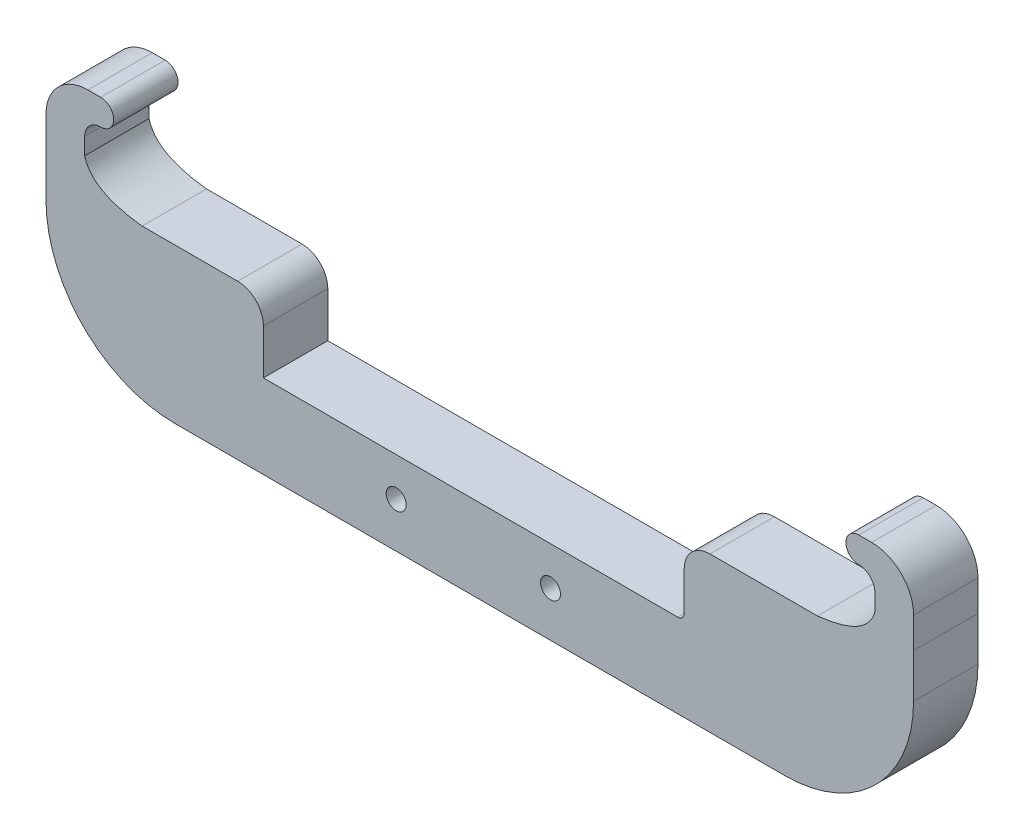
ISO-10303-21;
HEADER;
FILE_DESCRIPTION(('STEP AP214'),'2;1');
FILE_NAME('part.step','',(''),(''),'','','');
FILE_SCHEMA(('AUTOMOTIVE_DESIGN { 1 0 10303 214 1 1 1 1 }'));
ENDSEC;
DATA;
#1=APPLICATION_CONTEXT('core data for automotive mechanical design processes');
#2=APPLICATION_PROTOCOL_DEFINITION('international standard','automotive_design',2000,#1);
#3=PRODUCT_CONTEXT('',#1,'mechanical');
#4=PRODUCT('Part','Part','',(#3));
#5=PRODUCT_RELATED_PRODUCT_CATEGORY('part','',(#4));
#6=PRODUCT_DEFINITION_FORMATION('','',#4);
#7=PRODUCT_DEFINITION_CONTEXT('part definition',#1,'design');
#8=PRODUCT_DEFINITION('design','',#6,#7);
#9=PRODUCT_DEFINITION_SHAPE('','',#8);
#10=(LENGTH_UNIT() NAMED_UNIT(*) SI_UNIT(.MILLI.,.METRE.));
#11=(NAMED_UNIT(*) PLANE_ANGLE_UNIT() SI_UNIT($,.RADIAN.));
#12=(NAMED_UNIT(*) SI_UNIT($,.STERADIAN.) SOLID_ANGLE_UNIT());
#13=UNCERTAINTY_MEASURE_WITH_UNIT(LENGTH_MEASURE(1.E-05),#10,'distance_accuracy_value','');
#14=(GEOMETRIC_REPRESENTATION_CONTEXT(3) GLOBAL_UNCERTAINTY_ASSIGNED_CONTEXT((#13)) GLOBAL_UNIT_ASSIGNED_CONTEXT((#10,
#11,#12)) REPRESENTATION_CONTEXT('',''));
#15=CARTESIAN_POINT('',(0.,0.,0.));
#16=DIRECTION('',(0.,0.,1.));
#17=DIRECTION('',(1.,0.,0.));
#18=AXIS2_PLACEMENT_3D('',#15,#16,#17);
#19=CARTESIAN_POINT('',(559.303105377601,-407.696233575766,10.));
#20=DIRECTION('',(0.,0.,-1.));
#21=DIRECTION('',(-1.,0.,0.));
#22=AXIS2_PLACEMENT_3D('',#19,#20,#21);
#23=CYLINDRICAL_SURFACE('',#22,6.50000000000006);
#24=CARTESIAN_POINT('',(559.303105377601,-407.696233575766,0.));
#25=DIRECTION('',(0.,0.,1.));
#26=DIRECTION('',(1.,0.,0.));
#27=AXIS2_PLACEMENT_3D('',#24,#25,#26);
#28=CIRCLE('',#27,6.50000000000006);
#29=CARTESIAN_POINT('',(559.303105377601,-401.196233575766,0.));
#30=VERTEX_POINT('',#29);
#31=CARTESIAN_POINT('',(552.803105377601,-407.696233575766,0.));
#32=VERTEX_POINT('',#31);
#33=EDGE_CURVE('E237',#30,#32,#28,.T.);
#34=ORIENTED_EDGE('',*,*,#33,.T.);
#35=DIRECTION('',(0.,0.,-1.));
#36=VECTOR('',#35,1.);
#37=CARTESIAN_POINT('',(552.803105377601,-407.696233575766,10.));
#38=LINE('',#37,#36);
#39=CARTESIAN_POINT('',(552.803105377601,-407.696233575766,10.));
#40=VERTEX_POINT('',#39);
#41=EDGE_CURVE('E11',#40,#32,#38,.T.);
#42=ORIENTED_EDGE('',*,*,#41,.F.);
#43=CARTESIAN_POINT('',(559.303105377601,-407.696233575766,10.));
#44=DIRECTION('',(0.,0.,1.));
#45=DIRECTION('',(1.,0.,0.));
#46=AXIS2_PLACEMENT_3D('',#43,#44,#45);
#47=CIRCLE('',#46,6.50000000000006);
#48=CARTESIAN_POINT('',(559.303105377601,-401.196233575766,10.));
#49=VERTEX_POINT('',#48);
#50=EDGE_CURVE('E317',#49,#40,#47,.T.);
#51=ORIENTED_EDGE('',*,*,#50,.F.);
#52=DIRECTION('',(0.,0.,-1.));
#53=VECTOR('',#52,1.);
#54=CARTESIAN_POINT('',(559.303105377601,-401.196233575766,10.));
#55=LINE('',#54,#53);
#56=EDGE_CURVE('E233',#49,#30,#55,.T.);
#57=ORIENTED_EDGE('',*,*,#56,.T.);
#58=EDGE_LOOP('',(#34,#42,#51,#57));
#59=FACE_BOUND('',#58,.T.);
#60=ADVANCED_FACE('F34',(#59),#23,.T.);
#61=CARTESIAN_POINT('',(552.803105377601,-412.499258381393,10.));
#62=DIRECTION('',(1.,0.,0.));
#63=DIRECTION('',(0.,0.,-1.));
#64=AXIS2_PLACEMENT_3D('',#61,#62,#63);
#65=PLANE('',#64);
#66=DIRECTION('',(0.,-1.,0.));
#67=VECTOR('',#66,1.);
#68=CARTESIAN_POINT('',(552.803105377601,-412.499258381393,0.));
#69=LINE('',#68,#67);
#70=CARTESIAN_POINT('',(552.803105377601,-419.296174139032,0.));
#71=VERTEX_POINT('',#70);
#72=EDGE_CURVE('E240',#32,#71,#69,.T.);
#73=ORIENTED_EDGE('',*,*,#72,.T.);
#74=DIRECTION('',(0.,0.,-1.));
#75=VECTOR('',#74,1.);
#76=CARTESIAN_POINT('',(552.803105377601,-419.296174139032,10.));
#77=LINE('',#76,#75);
#78=CARTESIAN_POINT('',(552.803105377601,-419.296174139032,10.));
#79=VERTEX_POINT('',#78);
#80=EDGE_CURVE('E42',#79,#71,#77,.T.);
#81=ORIENTED_EDGE('',*,*,#80,.F.);
#82=DIRECTION('',(0.,-1.,0.));
#83=VECTOR('',#82,1.);
#84=CARTESIAN_POINT('',(552.803105377601,-407.696233575766,10.));
#85=LINE('',#84,#83);
#86=EDGE_CURVE('E147',#40,#79,#85,.T.);
#87=ORIENTED_EDGE('',*,*,#86,.F.);
#88=ORIENTED_EDGE('',*,*,#41,.T.);
#89=EDGE_LOOP('',(#73,#81,#87,#88));
#90=FACE_BOUND('',#89,.T.);
#91=ADVANCED_FACE('F461',(#90),#65,.F.);
#92=CARTESIAN_POINT('',(572.803105377601,-419.296174139032,10.));
#93=DIRECTION('',(0.,0.,-1.));
#94=DIRECTION('',(-1.,0.,0.));
#95=AXIS2_PLACEMENT_3D('',#92,#93,#94);
#96=CYLINDRICAL_SURFACE('',#95,20.);
#97=CARTESIAN_POINT('',(572.803105377601,-419.296174139032,0.));
#98=DIRECTION('',(0.,0.,1.));
#99=DIRECTION('',(1.,0.,0.));
#100=AXIS2_PLACEMENT_3D('',#97,#98,#99);
#101=CIRCLE('',#100,20.);
#102=CARTESIAN_POINT('',(572.803105377601,-439.296174139032,0.));
#103=VERTEX_POINT('',#102);
#104=EDGE_CURVE('E243',#71,#103,#101,.T.);
#105=ORIENTED_EDGE('',*,*,#104,.T.);
#106=DIRECTION('',(0.,0.,-1.));
#107=VECTOR('',#106,1.);
#108=CARTESIAN_POINT('',(572.803105377601,-439.296174139032,10.));
#109=LINE('',#108,#107);
#110=CARTESIAN_POINT('',(572.803105377601,-439.296174139032,10.));
#111=VERTEX_POINT('',#110);
#112=EDGE_CURVE('E361',#111,#103,#109,.T.);
#113=ORIENTED_EDGE('',*,*,#112,.F.);
#114=CARTESIAN_POINT('',(572.803105377601,-419.296174139032,10.));
#115=DIRECTION('',(0.,0.,1.));
#116=DIRECTION('',(1.,0.,0.));
#117=AXIS2_PLACEMENT_3D('',#114,#115,#116);
#118=CIRCLE('',#117,20.);
#119=EDGE_CURVE('E369',#79,#111,#118,.T.);
#120=ORIENTED_EDGE('',*,*,#119,.F.);
#121=ORIENTED_EDGE('',*,*,#80,.T.);
#122=EDGE_LOOP('',(#105,#113,#120,#121));
#123=FACE_BOUND('',#122,.T.);
#124=ADVANCED_FACE('F367',(#123),#96,.T.);
#125=CARTESIAN_POINT('',(650.135201584219,-439.296174139032,10.));
#126=DIRECTION('',(0.,1.,0.));
#127=DIRECTION('',(0.,0.,1.));
#128=AXIS2_PLACEMENT_3D('',#125,#126,#127);
#129=PLANE('',#128);
#130=DIRECTION('',(1.,0.,0.));
#131=VECTOR('',#130,1.);
#132=CARTESIAN_POINT('',(650.135201584219,-439.296174139032,0.));
#133=LINE('',#132,#131);
#134=CARTESIAN_POINT('',(667.497764868729,-439.296174139032,0.));
#135=VERTEX_POINT('',#134);
#136=EDGE_CURVE('E246',#103,#135,#133,.T.);
#137=ORIENTED_EDGE('',*,*,#136,.T.);
#138=DIRECTION('',(0.,0.,-1.));
#139=VECTOR('',#138,1.);
#140=CARTESIAN_POINT('',(667.497764868729,-439.296174139032,10.));
#141=LINE('',#140,#139);
#142=CARTESIAN_POINT('',(667.497764868729,-439.296174139032,10.));
#143=VERTEX_POINT('',#142);
#144=EDGE_CURVE('E359',#143,#135,#141,.T.);
#145=ORIENTED_EDGE('',*,*,#144,.F.);
#146=DIRECTION('',(-1.,0.,0.));
#147=VECTOR('',#146,1.);
#148=CARTESIAN_POINT('',(588.3050680705,-439.296174139032,10.));
#149=LINE('',#148,#147);
#150=EDGE_CURVE('E379',#143,#111,#149,.T.);
#151=ORIENTED_EDGE('',*,*,#150,.T.);
#152=ORIENTED_EDGE('',*,*,#112,.T.);
#153=EDGE_LOOP('',(#137,#145,#151,#152));
#154=FACE_BOUND('',#153,.T.);
#155=ADVANCED_FACE('F378',(#154),#129,.F.);
#156=CARTESIAN_POINT('',(667.497764868729,-419.296174139032,10.));
#157=DIRECTION('',(0.,0.,-1.));
#158=DIRECTION('',(-1.,0.,0.));
#159=AXIS2_PLACEMENT_3D('',#156,#157,#158);
#160=CYLINDRICAL_SURFACE('',#159,20.);
#161=CARTESIAN_POINT('',(667.497764868729,-419.296174139032,0.));
#162=DIRECTION('',(0.,0.,-1.));
#163=DIRECTION('',(-1.,0.,0.));
#164=AXIS2_PLACEMENT_3D('',#161,#162,#163);
#165=CIRCLE('',#164,20.);
#166=CARTESIAN_POINT('',(687.497764868729,-419.296174139032,0.));
#167=VERTEX_POINT('',#166);
#168=EDGE_CURVE('E249',#167,#135,#165,.T.);
#169=ORIENTED_EDGE('',*,*,#168,.F.);
#170=DIRECTION('',(0.,0.,-1.));
#171=VECTOR('',#170,1.);
#172=CARTESIAN_POINT('',(687.497764868729,-419.296174139032,10.));
#173=LINE('',#172,#171);
#174=CARTESIAN_POINT('',(687.497764868729,-419.296174139032,10.));
#175=VERTEX_POINT('',#174);
#176=EDGE_CURVE('E357',#175,#167,#173,.T.);
#177=ORIENTED_EDGE('',*,*,#176,.F.);
#178=CARTESIAN_POINT('',(667.497764868729,-419.296174139032,10.));
#179=DIRECTION('',(0.,0.,-1.));
#180=DIRECTION('',(-1.,0.,0.));
#181=AXIS2_PLACEMENT_3D('',#178,#179,#180);
#182=CIRCLE('',#181,20.);
#183=EDGE_CURVE('E382',#175,#143,#182,.T.);
#184=ORIENTED_EDGE('',*,*,#183,.T.);
#185=ORIENTED_EDGE('',*,*,#144,.T.);
#186=EDGE_LOOP('',(#169,#177,#184,#185));
#187=FACE_BOUND('',#186,.T.);
#188=ADVANCED_FACE('F453',(#187),#160,.T.);
#189=CARTESIAN_POINT('',(687.497764868729,-419.296174139032,10.));
#190=DIRECTION('',(-0.999999691317996,-0.000785725086795451,0.));
#191=DIRECTION('',(0.000785725086795451,-0.999999691317996,0.));
#192=AXIS2_PLACEMENT_3D('',#189,#190,#191);
#193=PLANE('',#192);
#194=DIRECTION('',(-0.000785725086795451,0.999999691317996,0.));
#195=VECTOR('',#194,1.);
#196=CARTESIAN_POINT('',(687.497764868729,-419.296174139032,0.));
#197=LINE('',#196,#195);
#198=CARTESIAN_POINT('',(687.492424359857,-412.499258381393,0.));
#199=VERTEX_POINT('',#198);
#200=EDGE_CURVE('E252',#167,#199,#197,.T.);
#201=ORIENTED_EDGE('',*,*,#200,.T.);
#202=DIRECTION('',(0.,0.,-1.));
#203=VECTOR('',#202,1.);
#204=CARTESIAN_POINT('',(687.492424359857,-412.499258381393,10.));
#205=LINE('',#204,#203);
#206=CARTESIAN_POINT('',(687.492424359857,-412.499258381393,10.));
#207=VERTEX_POINT('',#206);
#208=EDGE_CURVE('E355',#207,#199,#205,.T.);
#209=ORIENTED_EDGE('',*,*,#208,.F.);
#210=DIRECTION('',(-0.000785725086795451,0.999999691317996,0.));
#211=VECTOR('',#210,1.);
#212=CARTESIAN_POINT('',(687.497764868729,-419.296174139032,10.));
#213=LINE('',#212,#211);
#214=EDGE_CURVE('E384',#175,#207,#213,.T.);
#215=ORIENTED_EDGE('',*,*,#214,.F.);
#216=ORIENTED_EDGE('',*,*,#176,.T.);
#217=EDGE_LOOP('',(#201,#209,#215,#216));
#218=FACE_BOUND('',#217,.T.);
#219=ADVANCED_FACE('F449',(#218),#193,.F.);
#220=CARTESIAN_POINT('',(687.492424359857,-407.696233575766,10.));
#221=DIRECTION('',(1.,0.,0.));
#222=DIRECTION('',(0.,0.,-1.));
#223=AXIS2_PLACEMENT_3D('',#220,#221,#222);
#224=PLANE('',#223);
#225=DIRECTION('',(0.,-1.,0.));
#226=VECTOR('',#225,1.);
#227=CARTESIAN_POINT('',(687.492424359857,-407.696233575766,0.));
#228=LINE('',#227,#226);
#229=CARTESIAN_POINT('',(687.492424359857,-407.696233575766,0.));
#230=VERTEX_POINT('',#229);
#231=EDGE_CURVE('E255',#230,#199,#228,.T.);
#232=ORIENTED_EDGE('',*,*,#231,.F.);
#233=DIRECTION('',(0.,0.,-1.));
#234=VECTOR('',#233,1.);
#235=CARTESIAN_POINT('',(687.492424359857,-407.696233575766,10.));
#236=LINE('',#235,#234);
#237=CARTESIAN_POINT('',(687.492424359857,-407.696233575766,10.));
#238=VERTEX_POINT('',#237);
#239=EDGE_CURVE('E353',#238,#230,#236,.T.);
#240=ORIENTED_EDGE('',*,*,#239,.F.);
#241=DIRECTION('',(0.,-1.,0.));
#242=VECTOR('',#241,1.);
#243=CARTESIAN_POINT('',(687.492424359857,-407.696233575766,10.));
#244=LINE('',#243,#242);
#245=EDGE_CURVE('E390',#238,#207,#244,.T.);
#246=ORIENTED_EDGE('',*,*,#245,.T.);
#247=ORIENTED_EDGE('',*,*,#208,.T.);
#248=EDGE_LOOP('',(#232,#240,#246,#247));
#249=FACE_BOUND('',#248,.T.);
#250=ADVANCED_FACE('F445',(#249),#224,.T.);
#251=CARTESIAN_POINT('',(680.992424359857,-407.696233575766,10.));
#252=DIRECTION('',(0.,0.,-1.));
#253=DIRECTION('',(-1.,0.,0.));
#254=AXIS2_PLACEMENT_3D('',#251,#252,#253);
#255=CYLINDRICAL_SURFACE('',#254,6.50000000000006);
#256=CARTESIAN_POINT('',(680.992424359857,-407.696233575766,0.));
#257=DIRECTION('',(0.,0.,-1.));
#258=DIRECTION('',(-1.,0.,0.));
#259=AXIS2_PLACEMENT_3D('',#256,#257,#258);
#260=CIRCLE('',#259,6.50000000000006);
#261=CARTESIAN_POINT('',(680.992424359857,-401.196233575766,0.));
#262=VERTEX_POINT('',#261);
#263=EDGE_CURVE('E258',#262,#230,#260,.T.);
#264=ORIENTED_EDGE('',*,*,#263,.F.);
#265=DIRECTION('',(0.,0.,-1.));
#266=VECTOR('',#265,1.);
#267=CARTESIAN_POINT('',(680.992424359857,-401.196233575766,10.));
#268=LINE('',#267,#266);
#269=CARTESIAN_POINT('',(680.992424359857,-401.196233575766,10.));
#270=VERTEX_POINT('',#269);
#271=EDGE_CURVE('E351',#270,#262,#268,.T.);
#272=ORIENTED_EDGE('',*,*,#271,.F.);
#273=CARTESIAN_POINT('',(680.992424359857,-407.696233575766,10.));
#274=DIRECTION('',(0.,0.,-1.));
#275=DIRECTION('',(-1.,0.,0.));
#276=AXIS2_PLACEMENT_3D('',#273,#274,#275);
#277=CIRCLE('',#276,6.50000000000006);
#278=EDGE_CURVE('E393',#270,#238,#277,.T.);
#279=ORIENTED_EDGE('',*,*,#278,.T.);
#280=ORIENTED_EDGE('',*,*,#239,.T.);
#281=EDGE_LOOP('',(#264,#272,#279,#280));
#282=FACE_BOUND('',#281,.T.);
#283=ADVANCED_FACE('F441',(#282),#255,.T.);
#284=CARTESIAN_POINT('',(678.992424359857,-401.196233575766,10.));
#285=DIRECTION('',(0.,1.,0.));
#286=DIRECTION('',(-1.,0.,0.));
#287=AXIS2_PLACEMENT_3D('',#284,#285,#286);
#288=PLANE('',#287);
#289=DIRECTION('',(1.,0.,0.));
#290=VECTOR('',#289,1.);
#291=CARTESIAN_POINT('',(678.992424359857,-401.196233575766,0.));
#292=LINE('',#291,#290);
#293=CARTESIAN_POINT('',(678.992424359857,-401.196233575766,0.));
#294=VERTEX_POINT('',#293);
#295=EDGE_CURVE('E261',#294,#262,#292,.T.);
#296=ORIENTED_EDGE('',*,*,#295,.F.);
#297=DIRECTION('',(0.,0.,-1.));
#298=VECTOR('',#297,1.);
#299=CARTESIAN_POINT('',(678.992424359857,-401.196233575766,10.));
#300=LINE('',#299,#298);
#301=CARTESIAN_POINT('',(678.992424359857,-401.196233575766,10.));
#302=VERTEX_POINT('',#301);
#303=EDGE_CURVE('E349',#302,#294,#300,.T.);
#304=ORIENTED_EDGE('',*,*,#303,.F.);
#305=DIRECTION('',(1.,0.,0.));
#306=VECTOR('',#305,1.);
#307=CARTESIAN_POINT('',(678.992424359857,-401.196233575766,10.));
#308=LINE('',#307,#306);
#309=EDGE_CURVE('E396',#302,#270,#308,.T.);
#310=ORIENTED_EDGE('',*,*,#309,.T.);
#311=ORIENTED_EDGE('',*,*,#271,.T.);
#312=EDGE_LOOP('',(#296,#304,#310,#311));
#313=FACE_BOUND('',#312,.T.);
#314=ADVANCED_FACE('F437',(#313),#288,.T.);
#315=CARTESIAN_POINT('',(678.992424359857,-403.196233575766,10.));
#316=DIRECTION('',(0.,0.,-1.));
#317=DIRECTION('',(-1.,0.,0.));
#318=AXIS2_PLACEMENT_3D('',#315,#316,#317);
#319=CYLINDRICAL_SURFACE('',#318,1.99999999999995);
#320=CARTESIAN_POINT('',(678.992424359857,-403.196233575766,0.));
#321=DIRECTION('',(0.,0.,-1.));
#322=DIRECTION('',(-1.,0.,0.));
#323=AXIS2_PLACEMENT_3D('',#320,#321,#322);
#324=CIRCLE('',#323,1.99999999999995);
#325=CARTESIAN_POINT('',(678.992424359857,-405.196233575766,0.));
#326=VERTEX_POINT('',#325);
#327=EDGE_CURVE('E264',#326,#294,#324,.T.);
#328=ORIENTED_EDGE('',*,*,#327,.F.);
#329=DIRECTION('',(0.,0.,-1.));
#330=VECTOR('',#329,1.);
#331=CARTESIAN_POINT('',(678.992424359857,-405.196233575766,10.));
#332=LINE('',#331,#330);
#333=CARTESIAN_POINT('',(678.992424359857,-405.196233575766,10.));
#334=VERTEX_POINT('',#333);
#335=EDGE_CURVE('E347',#334,#326,#332,.T.);
#336=ORIENTED_EDGE('',*,*,#335,.F.);
#337=CARTESIAN_POINT('',(678.992424359857,-403.196233575766,10.));
#338=DIRECTION('',(0.,0.,-1.));
#339=DIRECTION('',(-1.,0.,0.));
#340=AXIS2_PLACEMENT_3D('',#337,#338,#339);
#341=CIRCLE('',#340,1.99999999999995);
#342=EDGE_CURVE('E399',#334,#302,#341,.T.);
#343=ORIENTED_EDGE('',*,*,#342,.T.);
#344=ORIENTED_EDGE('',*,*,#303,.T.);
#345=EDGE_LOOP('',(#328,#336,#343,#344));
#346=FACE_BOUND('',#345,.T.);
#347=ADVANCED_FACE('F433',(#346),#319,.T.);
#348=CARTESIAN_POINT('',(678.992424359857,-407.696233575766,10.));
#349=DIRECTION('',(0.,0.,-1.));
#350=DIRECTION('',(-1.,0.,0.));
#351=AXIS2_PLACEMENT_3D('',#348,#349,#350);
#352=CYLINDRICAL_SURFACE('',#351,2.50000000000017);
#353=CARTESIAN_POINT('',(678.992424359857,-407.696233575766,0.));
#354=DIRECTION('',(0.,0.,1.));
#355=DIRECTION('',(1.,0.,0.));
#356=AXIS2_PLACEMENT_3D('',#353,#354,#355);
#357=CIRCLE('',#356,2.50000000000017);
#358=CARTESIAN_POINT('',(681.492424359857,-407.696233575766,0.));
#359=VERTEX_POINT('',#358);
#360=EDGE_CURVE('E267',#359,#326,#357,.T.);
#361=ORIENTED_EDGE('',*,*,#360,.F.);
#362=DIRECTION('',(0.,0.,-1.));
#363=VECTOR('',#362,1.);
#364=CARTESIAN_POINT('',(681.492424359857,-407.696233575766,10.));
#365=LINE('',#364,#363);
#366=CARTESIAN_POINT('',(681.492424359857,-407.696233575766,10.));
#367=VERTEX_POINT('',#366);
#368=EDGE_CURVE('E345',#367,#359,#365,.T.);
#369=ORIENTED_EDGE('',*,*,#368,.F.);
#370=CARTESIAN_POINT('',(678.992424359857,-407.696233575766,10.));
#371=DIRECTION('',(0.,0.,1.));
#372=DIRECTION('',(1.,0.,0.));
#373=AXIS2_PLACEMENT_3D('',#370,#371,#372);
#374=CIRCLE('',#373,2.50000000000017);
#375=EDGE_CURVE('E402',#367,#334,#374,.T.);
#376=ORIENTED_EDGE('',*,*,#375,.T.);
#377=ORIENTED_EDGE('',*,*,#335,.T.);
#378=EDGE_LOOP('',(#361,#369,#376,#377));
#379=FACE_BOUND('',#378,.T.);
#380=ADVANCED_FACE('F429',(#379),#352,.F.);
#381=CARTESIAN_POINT('',(681.492424359857,-407.696233575766,10.));
#382=DIRECTION('',(1.,0.,0.));
#383=DIRECTION('',(0.,0.,-1.));
#384=AXIS2_PLACEMENT_3D('',#381,#382,#383);
#385=PLANE('',#384);
#386=DIRECTION('',(0.,-1.,0.));
#387=VECTOR('',#386,1.);
#388=CARTESIAN_POINT('',(681.492424359857,-407.696233575766,0.));
#389=LINE('',#388,#387);
#390=CARTESIAN_POINT('',(681.492424359857,-410.309613133762,0.));
#391=VERTEX_POINT('',#390);
#392=EDGE_CURVE('E270',#359,#391,#389,.T.);
#393=ORIENTED_EDGE('',*,*,#392,.T.);
#394=DIRECTION('',(0.,0.,-1.));
#395=VECTOR('',#394,1.);
#396=CARTESIAN_POINT('',(681.492424359857,-410.309613133762,10.));
#397=LINE('',#396,#395);
#398=CARTESIAN_POINT('',(681.492424359857,-410.309613133762,10.));
#399=VERTEX_POINT('',#398);
#400=EDGE_CURVE('E343',#399,#391,#397,.T.);
#401=ORIENTED_EDGE('',*,*,#400,.F.);
#402=DIRECTION('',(0.,-1.,0.));
#403=VECTOR('',#402,1.);
#404=CARTESIAN_POINT('',(681.492424359857,-407.696233575766,10.));
#405=LINE('',#404,#403);
#406=EDGE_CURVE('E405',#367,#399,#405,.T.);
#407=ORIENTED_EDGE('',*,*,#406,.F.);
#408=ORIENTED_EDGE('',*,*,#368,.T.);
#409=EDGE_LOOP('',(#393,#401,#407,#408));
#410=FACE_BOUND('',#409,.T.);
#411=ADVANCED_FACE('F424',(#410),#385,.F.);
#412=CARTESIAN_POINT('',(672.570535689428,-415.296173960856,10.));
#413=CARTESIAN_POINT('',(680.33925251265,-414.463379513949,10.));
#414=CARTESIAN_POINT('',(681.492424359857,-410.309613133762,10.));
#415=B_SPLINE_CURVE_WITH_KNOTS('',2,(#412,#413,#414),.UNSPECIFIED.,.F.,.F.,(3,3),(0.,
0.645201514601835),.UNSPECIFIED.);
#416=DIRECTION('',(0.,0.,-1.));
#417=VECTOR('',#416,1.);
#418=SURFACE_OF_LINEAR_EXTRUSION('',#415,#417);
#419=CARTESIAN_POINT('',(672.570535689428,-415.296173960856,0.));
#420=CARTESIAN_POINT('',(680.33925251265,-414.463379513949,0.));
#421=CARTESIAN_POINT('',(681.492424359857,-410.309613133762,0.));
#422=B_SPLINE_CURVE_WITH_KNOTS('',2,(#419,#420,#421),.UNSPECIFIED.,.F.,.F.,(3,3),(0.,
0.645201514601835),.UNSPECIFIED.);
#423=CARTESIAN_POINT('',(672.570535689428,-415.296173960856,0.));
#424=VERTEX_POINT('',#423);
#425=EDGE_CURVE('E273',#424,#391,#422,.T.);
#426=ORIENTED_EDGE('',*,*,#425,.F.);
#427=DIRECTION('',(0.,0.,-1.));
#428=VECTOR('',#427,1.);
#429=CARTESIAN_POINT('',(672.570535689428,-415.296173960856,10.));
#430=LINE('',#429,#428);
#431=CARTESIAN_POINT('',(672.570535689428,-415.296173960856,10.));
#432=VERTEX_POINT('',#431);
#433=EDGE_CURVE('E341',#432,#424,#430,.T.);
#434=ORIENTED_EDGE('',*,*,#433,.F.);
#435=EDGE_CURVE('E407',#432,#399,#415,.T.);
#436=ORIENTED_EDGE('',*,*,#435,.T.);
#437=ORIENTED_EDGE('',*,*,#400,.T.);
#438=EDGE_LOOP('',(#426,#434,#436,#437));
#439=FACE_BOUND('',#438,.T.);
#440=ADVANCED_FACE('F419',(#439),#418,.T.);
#441=CARTESIAN_POINT('',(672.570535689428,-415.296173960856,10.));
#442=DIRECTION('',(0.,-1.,0.));
#443=DIRECTION('',(0.,0.,-1.));
#444=AXIS2_PLACEMENT_3D('',#441,#442,#443);
#445=PLANE('',#444);
#446=DIRECTION('',(-1.,0.,0.));
#447=VECTOR('',#446,1.);
#448=CARTESIAN_POINT('',(672.570535689428,-415.296173960856,0.));
#449=LINE('',#448,#447);
#450=CARTESIAN_POINT('',(655.885201584219,-415.296173960856,0.));
#451=VERTEX_POINT('',#450);
#452=EDGE_CURVE('E278',#424,#451,#449,.T.);
#453=ORIENTED_EDGE('',*,*,#452,.T.);
#454=DIRECTION('',(0.,0.,-1.));
#455=VECTOR('',#454,1.);
#456=CARTESIAN_POINT('',(655.885201584219,-415.296173960856,10.));
#457=LINE('',#456,#455);
#458=CARTESIAN_POINT('',(655.885201584219,-415.296173960856,10.));
#459=VERTEX_POINT('',#458);
#460=EDGE_CURVE('E338',#459,#451,#457,.T.);
#461=ORIENTED_EDGE('',*,*,#460,.F.);
#462=DIRECTION('',(-1.,0.,0.));
#463=VECTOR('',#462,1.);
#464=CARTESIAN_POINT('',(672.570535689428,-415.296173960856,10.));
#465=LINE('',#464,#463);
#466=EDGE_CURVE('E413',#432,#459,#465,.T.);
#467=ORIENTED_EDGE('',*,*,#466,.F.);
#468=ORIENTED_EDGE('',*,*,#433,.T.);
#469=EDGE_LOOP('',(#453,#461,#467,#468));
#470=FACE_BOUND('',#469,.T.);
#471=ADVANCED_FACE('F423',(#470),#445,.F.);
#472=CARTESIAN_POINT('',(655.885201584219,-419.296173960856,10.));
#473=DIRECTION('',(0.,0.,-1.));
#474=DIRECTION('',(-1.,0.,0.));
#475=AXIS2_PLACEMENT_3D('',#472,#473,#474);
#476=CYLINDRICAL_SURFACE('',#475,4.);
#477=CARTESIAN_POINT('',(655.885201584219,-419.296173960856,0.));
#478=DIRECTION('',(0.,0.,1.));
#479=DIRECTION('',(1.,0.,0.));
#480=AXIS2_PLACEMENT_3D('',#477,#478,#479);
#481=CIRCLE('',#480,4.);
#482=CARTESIAN_POINT('',(651.885201584219,-419.296173960856,0.));
#483=VERTEX_POINT('',#482);
#484=EDGE_CURVE('E283',#451,#483,#481,.T.);
#485=ORIENTED_EDGE('',*,*,#484,.T.);
#486=DIRECTION('',(0.,0.,-1.));
#487=VECTOR('',#486,1.);
#488=CARTESIAN_POINT('',(651.885201584219,-419.296173960856,10.));
#489=LINE('',#488,#487);
#490=CARTESIAN_POINT('',(651.885201584219,-419.296173960856,10.));
#491=VERTEX_POINT('',#490);
#492=EDGE_CURVE('E336',#491,#483,#489,.T.);
#493=ORIENTED_EDGE('',*,*,#492,.F.);
#494=CARTESIAN_POINT('',(655.885201584219,-419.296173960856,10.));
#495=DIRECTION('',(0.,0.,1.));
#496=DIRECTION('',(1.,0.,0.));
#497=AXIS2_PLACEMENT_3D('',#494,#495,#496);
#498=CIRCLE('',#497,4.);
#499=EDGE_CURVE('E516',#459,#491,#498,.T.);
#500=ORIENTED_EDGE('',*,*,#499,.F.);
#501=ORIENTED_EDGE('',*,*,#460,.T.);
#502=EDGE_LOOP('',(#485,#493,#500,#501));
#503=FACE_BOUND('',#502,.T.);
#504=ADVANCED_FACE('F514',(#503),#476,.T.);
#505=CARTESIAN_POINT('',(651.885201584219,-425.296174139032,10.));
#506=DIRECTION('',(-1.,0.,0.));
#507=DIRECTION('',(0.,0.,1.));
#508=AXIS2_PLACEMENT_3D('',#505,#506,#507);
#509=PLANE('',#508);
#510=DIRECTION('',(0.,1.,0.));
#511=VECTOR('',#510,1.);
#512=CARTESIAN_POINT('',(651.885201584219,-425.296174139032,0.));
#513=LINE('',#512,#511);
#514=CARTESIAN_POINT('',(651.885201584219,-425.296174139032,0.));
#515=VERTEX_POINT('',#514);
#516=EDGE_CURVE('E286',#515,#483,#513,.T.);
#517=ORIENTED_EDGE('',*,*,#516,.F.);
#518=DIRECTION('',(0.,0.,-1.));
#519=VECTOR('',#518,1.);
#520=CARTESIAN_POINT('',(651.885201584219,-425.296174139032,10.));
#521=LINE('',#520,#519);
#522=CARTESIAN_POINT('',(651.885201584219,-425.296174139032,10.));
#523=VERTEX_POINT('',#522);
#524=EDGE_CURVE('E334',#523,#515,#521,.T.);
#525=ORIENTED_EDGE('',*,*,#524,.F.);
#526=DIRECTION('',(0.,1.,0.));
#527=VECTOR('',#526,1.);
#528=CARTESIAN_POINT('',(651.885201584219,-425.296174139032,10.));
#529=LINE('',#528,#527);
#530=EDGE_CURVE('E511',#523,#491,#529,.T.);
#531=ORIENTED_EDGE('',*,*,#530,.T.);
#532=ORIENTED_EDGE('',*,*,#492,.T.);
#533=EDGE_LOOP('',(#517,#525,#531,#532));
#534=FACE_BOUND('',#533,.T.);
#535=ADVANCED_FACE('F507',(#534),#509,.T.);
#536=CARTESIAN_POINT('',(650.885201584219,-425.296174139032,10.));
#537=DIRECTION('',(0.,0.,-1.));
#538=DIRECTION('',(-1.,0.,0.));
#539=AXIS2_PLACEMENT_3D('',#536,#537,#538);
#540=CYLINDRICAL_SURFACE('',#539,1.);
#541=CARTESIAN_POINT('',(650.885201584219,-425.296174139032,0.));
#542=DIRECTION('',(0.,0.,1.));
#543=DIRECTION('',(1.,0.,0.));
#544=AXIS2_PLACEMENT_3D('',#541,#542,#543);
#545=CIRCLE('',#544,1.);
#546=CARTESIAN_POINT('',(650.885201584219,-426.296174139032,0.));
#547=VERTEX_POINT('',#546);
#548=EDGE_CURVE('E289',#547,#515,#545,.T.);
#549=ORIENTED_EDGE('',*,*,#548,.F.);
#550=DIRECTION('',(0.,0.,-1.));
#551=VECTOR('',#550,1.);
#552=CARTESIAN_POINT('',(650.885201584219,-426.296174139032,10.));
#553=LINE('',#552,#551);
#554=CARTESIAN_POINT('',(650.885201584219,-426.296174139032,10.));
#555=VERTEX_POINT('',#554);
#556=EDGE_CURVE('E331',#555,#547,#553,.T.);
#557=ORIENTED_EDGE('',*,*,#556,.F.);
#558=CARTESIAN_POINT('',(650.885201584219,-425.296174139032,10.));
#559=DIRECTION('',(0.,0.,1.));
#560=DIRECTION('',(1.,0.,0.));
#561=AXIS2_PLACEMENT_3D('',#558,#559,#560);
#562=CIRCLE('',#561,1.);
#563=EDGE_CURVE('E536',#555,#523,#562,.T.);
#564=ORIENTED_EDGE('',*,*,#563,.T.);
#565=ORIENTED_EDGE('',*,*,#524,.T.);
#566=EDGE_LOOP('',(#549,#557,#564,#565));
#567=FACE_BOUND('',#566,.T.);
#568=ADVANCED_FACE('F502',(#567),#540,.F.);
#569=CARTESIAN_POINT('',(586.5550680705,-426.296174139032,10.));
#570=DIRECTION('',(0.,1.,0.));
#571=DIRECTION('',(0.,0.,1.));
#572=AXIS2_PLACEMENT_3D('',#569,#570,#571);
#573=PLANE('',#572);
#574=DIRECTION('',(1.,0.,0.));
#575=VECTOR('',#574,1.);
#576=CARTESIAN_POINT('',(586.5550680705,-426.296174139032,0.));
#577=LINE('',#576,#575);
#578=CARTESIAN_POINT('',(586.5550680705,-426.296174139032,0.));
#579=VERTEX_POINT('',#578);
#580=EDGE_CURVE('E292',#579,#547,#577,.T.);
#581=ORIENTED_EDGE('',*,*,#580,.F.);
#582=DIRECTION('',(0.,0.,-1.));
#583=VECTOR('',#582,1.);
#584=CARTESIAN_POINT('',(586.5550680705,-426.296174139032,10.));
#585=LINE('',#584,#583);
#586=CARTESIAN_POINT('',(586.5550680705,-426.296174139032,10.));
#587=VERTEX_POINT('',#586);
#588=EDGE_CURVE('E329',#587,#579,#585,.T.);
#589=ORIENTED_EDGE('',*,*,#588,.F.);
#590=DIRECTION('',(1.,0.,0.));
#591=VECTOR('',#590,1.);
#592=CARTESIAN_POINT('',(647.885201584219,-426.296174139032,10.));
#593=LINE('',#592,#591);
#594=EDGE_CURVE('E498',#587,#555,#593,.T.);
#595=ORIENTED_EDGE('',*,*,#594,.T.);
#596=ORIENTED_EDGE('',*,*,#556,.T.);
#597=EDGE_LOOP('',(#581,#589,#595,#596));
#598=FACE_BOUND('',#597,.T.);
#599=ADVANCED_FACE('F494',(#598),#573,.T.);
#600=CARTESIAN_POINT('',(586.5550680705,-426.296174139032,10.));
#601=DIRECTION('',(-1.,0.,0.));
#602=DIRECTION('',(0.,0.,1.));
#603=AXIS2_PLACEMENT_3D('',#600,#601,#602);
#604=PLANE('',#603);
#605=DIRECTION('',(0.,1.,0.));
#606=VECTOR('',#605,1.);
#607=CARTESIAN_POINT('',(586.5550680705,-426.296174139032,0.));
#608=LINE('',#607,#606);
#609=CARTESIAN_POINT('',(586.5550680705,-419.296173960856,0.));
#610=VERTEX_POINT('',#609);
#611=EDGE_CURVE('E294',#579,#610,#608,.T.);
#612=ORIENTED_EDGE('',*,*,#611,.T.);
#613=DIRECTION('',(0.,0.,-1.));
#614=VECTOR('',#613,1.);
#615=CARTESIAN_POINT('',(586.5550680705,-419.296173960856,10.));
#616=LINE('',#615,#614);
#617=CARTESIAN_POINT('',(586.5550680705,-419.296173960856,10.));
#618=VERTEX_POINT('',#617);
#619=EDGE_CURVE('E327',#618,#610,#616,.T.);
#620=ORIENTED_EDGE('',*,*,#619,.F.);
#621=DIRECTION('',(0.,1.,0.));
#622=VECTOR('',#621,1.);
#623=CARTESIAN_POINT('',(586.5550680705,-426.296174139032,10.));
#624=LINE('',#623,#622);
#625=EDGE_CURVE('E541',#587,#618,#624,.T.);
#626=ORIENTED_EDGE('',*,*,#625,.F.);
#627=ORIENTED_EDGE('',*,*,#588,.T.);
#628=EDGE_LOOP('',(#612,#620,#626,#627));
#629=FACE_BOUND('',#628,.T.);
#630=ADVANCED_FACE('F562',(#629),#604,.F.);
#631=CARTESIAN_POINT('',(582.5550680705,-419.296173960856,10.));
#632=DIRECTION('',(0.,0.,-1.));
#633=DIRECTION('',(-1.,0.,0.));
#634=AXIS2_PLACEMENT_3D('',#631,#632,#633);
#635=CYLINDRICAL_SURFACE('',#634,4.);
#636=CARTESIAN_POINT('',(582.5550680705,-419.296173960856,0.));
#637=DIRECTION('',(0.,0.,-1.));
#638=DIRECTION('',(-1.,0.,0.));
#639=AXIS2_PLACEMENT_3D('',#636,#637,#638);
#640=CIRCLE('',#639,4.);
#641=CARTESIAN_POINT('',(582.5550680705,-415.296173960856,0.));
#642=VERTEX_POINT('',#641);
#643=EDGE_CURVE('E297',#642,#610,#640,.T.);
#644=ORIENTED_EDGE('',*,*,#643,.F.);
#645=DIRECTION('',(0.,0.,-1.));
#646=VECTOR('',#645,1.);
#647=CARTESIAN_POINT('',(582.5550680705,-415.296173960856,10.));
#648=LINE('',#647,#646);
#649=CARTESIAN_POINT('',(582.5550680705,-415.296173960856,10.));
#650=VERTEX_POINT('',#649);
#651=EDGE_CURVE('E325',#650,#642,#648,.T.);
#652=ORIENTED_EDGE('',*,*,#651,.F.);
#653=CARTESIAN_POINT('',(582.5550680705,-419.296173960856,10.));
#654=DIRECTION('',(0.,0.,-1.));
#655=DIRECTION('',(-1.,0.,0.));
#656=AXIS2_PLACEMENT_3D('',#653,#654,#655);
#657=CIRCLE('',#656,4.);
#658=EDGE_CURVE('E543',#650,#618,#657,.T.);
#659=ORIENTED_EDGE('',*,*,#658,.T.);
#660=ORIENTED_EDGE('',*,*,#619,.T.);
#661=EDGE_LOOP('',(#644,#652,#659,#660));
#662=FACE_BOUND('',#661,.T.);
#663=ADVANCED_FACE('F487',(#662),#635,.T.);
#664=CARTESIAN_POINT('',(567.72499404803,-415.296173960856,10.));
#665=DIRECTION('',(0.,1.,0.));
#666=DIRECTION('',(0.,0.,1.));
#667=AXIS2_PLACEMENT_3D('',#664,#665,#666);
#668=PLANE('',#667);
#669=DIRECTION('',(1.,0.,0.));
#670=VECTOR('',#669,1.);
#671=CARTESIAN_POINT('',(567.72499404803,-415.296173960856,0.));
#672=LINE('',#671,#670);
#673=CARTESIAN_POINT('',(567.72499404803,-415.296173960856,0.));
#674=VERTEX_POINT('',#673);
#675=EDGE_CURVE('E300',#674,#642,#672,.T.);
#676=ORIENTED_EDGE('',*,*,#675,.F.);
#677=DIRECTION('',(0.,0.,-1.));
#678=VECTOR('',#677,1.);
#679=CARTESIAN_POINT('',(567.72499404803,-415.296173960856,10.));
#680=LINE('',#679,#678);
#681=CARTESIAN_POINT('',(567.72499404803,-415.296173960856,10.));
#682=VERTEX_POINT('',#681);
#683=EDGE_CURVE('E323',#682,#674,#680,.T.);
#684=ORIENTED_EDGE('',*,*,#683,.F.);
#685=DIRECTION('',(1.,0.,0.));
#686=VECTOR('',#685,1.);
#687=CARTESIAN_POINT('',(567.72499404803,-415.296173960856,10.));
#688=LINE('',#687,#686);
#689=EDGE_CURVE('E483',#682,#650,#688,.T.);
#690=ORIENTED_EDGE('',*,*,#689,.T.);
#691=ORIENTED_EDGE('',*,*,#651,.T.);
#692=EDGE_LOOP('',(#676,#684,#690,#691));
#693=FACE_BOUND('',#692,.T.);
#694=ADVANCED_FACE('F479',(#693),#668,.T.);
#695=CARTESIAN_POINT('',(567.72499404803,-415.296173960856,10.));
#696=CARTESIAN_POINT('',(559.956277224808,-414.463379513949,10.));
#697=CARTESIAN_POINT('',(558.803105377601,-410.309613133762,10.));
#698=B_SPLINE_CURVE_WITH_KNOTS('',2,(#695,#696,#697),.UNSPECIFIED.,.F.,.F.,(3,3),(0.,
0.645201514601835),.UNSPECIFIED.);
#699=DIRECTION('',(0.,0.,-1.));
#700=VECTOR('',#699,1.);
#701=SURFACE_OF_LINEAR_EXTRUSION('',#698,#700);
#702=CARTESIAN_POINT('',(567.72499404803,-415.296173960856,0.));
#703=CARTESIAN_POINT('',(559.956277224808,-414.463379513949,0.));
#704=CARTESIAN_POINT('',(558.803105377601,-410.309613133762,0.));
#705=B_SPLINE_CURVE_WITH_KNOTS('',2,(#702,#703,#704),.UNSPECIFIED.,.F.,.F.,(3,3),(0.,
0.645201514601835),.UNSPECIFIED.);
#706=CARTESIAN_POINT('',(558.803105377601,-410.309613133762,0.));
#707=VERTEX_POINT('',#706);
#708=EDGE_CURVE('E303',#674,#707,#705,.T.);
#709=ORIENTED_EDGE('',*,*,#708,.T.);
#710=DIRECTION('',(0.,0.,-1.));
#711=VECTOR('',#710,1.);
#712=CARTESIAN_POINT('',(558.803105377601,-410.309613133762,10.));
#713=LINE('',#712,#711);
#714=CARTESIAN_POINT('',(558.803105377601,-410.309613133762,10.));
#715=VERTEX_POINT('',#714);
#716=EDGE_CURVE('E321',#715,#707,#713,.T.);
#717=ORIENTED_EDGE('',*,*,#716,.F.);
#718=EDGE_CURVE('E546',#682,#715,#698,.T.);
#719=ORIENTED_EDGE('',*,*,#718,.F.);
#720=ORIENTED_EDGE('',*,*,#683,.T.);
#721=EDGE_LOOP('',(#709,#717,#719,#720));
#722=FACE_BOUND('',#721,.T.);
#723=ADVANCED_FACE('F476',(#722),#701,.F.);
#724=CARTESIAN_POINT('',(558.803105377601,-407.696233575766,10.));
#725=DIRECTION('',(1.,0.,0.));
#726=DIRECTION('',(0.,0.,-1.));
#727=AXIS2_PLACEMENT_3D('',#724,#725,#726);
#728=PLANE('',#727);
#729=DIRECTION('',(0.,-1.,0.));
#730=VECTOR('',#729,1.);
#731=CARTESIAN_POINT('',(558.803105377601,-407.696233575766,0.));
#732=LINE('',#731,#730);
#733=CARTESIAN_POINT('',(558.803105377601,-407.696233575766,0.));
#734=VERTEX_POINT('',#733);
#735=EDGE_CURVE('E308',#734,#707,#732,.T.);
#736=ORIENTED_EDGE('',*,*,#735,.F.);
#737=DIRECTION('',(0.,0.,-1.));
#738=VECTOR('',#737,1.);
#739=CARTESIAN_POINT('',(558.803105377601,-407.696233575766,10.));
#740=LINE('',#739,#738);
#741=CARTESIAN_POINT('',(558.803105377601,-407.696233575766,10.));
#742=VERTEX_POINT('',#741);
#743=EDGE_CURVE('E228',#742,#734,#740,.T.);
#744=ORIENTED_EDGE('',*,*,#743,.F.);
#745=DIRECTION('',(0.,-1.,0.));
#746=VECTOR('',#745,1.);
#747=CARTESIAN_POINT('',(558.803105377601,-407.696233575766,10.));
#748=LINE('',#747,#746);
#749=EDGE_CURVE('E221',#742,#715,#748,.T.);
#750=ORIENTED_EDGE('',*,*,#749,.T.);
#751=ORIENTED_EDGE('',*,*,#716,.T.);
#752=EDGE_LOOP('',(#736,#744,#750,#751));
#753=FACE_BOUND('',#752,.T.);
#754=ADVANCED_FACE('F472',(#753),#728,.T.);
#755=CARTESIAN_POINT('',(561.303105377601,-407.696233575766,10.));
#756=DIRECTION('',(0.,0.,-1.));
#757=DIRECTION('',(-1.,0.,0.));
#758=AXIS2_PLACEMENT_3D('',#755,#756,#757);
#759=CYLINDRICAL_SURFACE('',#758,2.50000000000017);
#760=CARTESIAN_POINT('',(561.303105377601,-407.696233575766,0.));
#761=DIRECTION('',(0.,0.,-1.));
#762=DIRECTION('',(-1.,0.,0.));
#763=AXIS2_PLACEMENT_3D('',#760,#761,#762);
#764=CIRCLE('',#763,2.50000000000017);
#765=CARTESIAN_POINT('',(561.303105377601,-405.196233575766,0.));
#766=VERTEX_POINT('',#765);
#767=EDGE_CURVE('E227',#734,#766,#764,.T.);
#768=ORIENTED_EDGE('',*,*,#767,.T.);
#769=DIRECTION('',(0.,0.,-1.));
#770=VECTOR('',#769,1.);
#771=CARTESIAN_POINT('',(561.303105377601,-405.196233575766,10.));
#772=LINE('',#771,#770);
#773=CARTESIAN_POINT('',(561.303105377601,-405.196233575766,10.));
#774=VERTEX_POINT('',#773);
#775=EDGE_CURVE('E224',#774,#766,#772,.T.);
#776=ORIENTED_EDGE('',*,*,#775,.F.);
#777=CARTESIAN_POINT('',(561.303105377601,-407.696233575766,10.));
#778=DIRECTION('',(0.,0.,-1.));
#779=DIRECTION('',(-1.,0.,0.));
#780=AXIS2_PLACEMENT_3D('',#777,#778,#779);
#781=CIRCLE('',#780,2.50000000000017);
#782=EDGE_CURVE('E215',#742,#774,#781,.T.);
#783=ORIENTED_EDGE('',*,*,#782,.F.);
#784=ORIENTED_EDGE('',*,*,#743,.T.);
#785=EDGE_LOOP('',(#768,#776,#783,#784));
#786=FACE_BOUND('',#785,.T.);
#787=ADVANCED_FACE('F225',(#786),#759,.F.);
#788=CARTESIAN_POINT('',(561.303105377601,-403.196233575766,10.));
#789=DIRECTION('',(0.,0.,-1.));
#790=DIRECTION('',(-1.,0.,0.));
#791=AXIS2_PLACEMENT_3D('',#788,#789,#790);
#792=CYLINDRICAL_SURFACE('',#791,1.99999999999995);
#793=CARTESIAN_POINT('',(561.303105377601,-403.196233575766,0.));
#794=DIRECTION('',(0.,0.,1.));
#795=DIRECTION('',(1.,0.,0.));
#796=AXIS2_PLACEMENT_3D('',#793,#794,#795);
#797=CIRCLE('',#796,1.99999999999995);
#798=CARTESIAN_POINT('',(561.303105377601,-401.196233575766,0.));
#799=VERTEX_POINT('',#798);
#800=EDGE_CURVE('E133',#766,#799,#797,.T.);
#801=ORIENTED_EDGE('',*,*,#800,.T.);
#802=DIRECTION('',(0.,0.,-1.));
#803=VECTOR('',#802,1.);
#804=CARTESIAN_POINT('',(561.303105377601,-401.196233575766,10.));
#805=LINE('',#804,#803);
#806=CARTESIAN_POINT('',(561.303105377601,-401.196233575766,10.));
#807=VERTEX_POINT('',#806);
#808=EDGE_CURVE('E229',#807,#799,#805,.T.);
#809=ORIENTED_EDGE('',*,*,#808,.F.);
#810=CARTESIAN_POINT('',(561.303105377601,-403.196233575766,10.));
#811=DIRECTION('',(0.,0.,1.));
#812=DIRECTION('',(1.,0.,0.));
#813=AXIS2_PLACEMENT_3D('',#810,#811,#812);
#814=CIRCLE('',#813,1.99999999999995);
#815=EDGE_CURVE('E219',#774,#807,#814,.T.);
#816=ORIENTED_EDGE('',*,*,#815,.F.);
#817=ORIENTED_EDGE('',*,*,#775,.T.);
#818=EDGE_LOOP('',(#801,#809,#816,#817));
#819=FACE_BOUND('',#818,.T.);
#820=ADVANCED_FACE('F231',(#819),#792,.T.);
#821=CARTESIAN_POINT('',(561.303105377601,-401.196233575766,10.));
#822=DIRECTION('',(0.,-1.,0.));
#823=DIRECTION('',(1.,0.,0.));
#824=AXIS2_PLACEMENT_3D('',#821,#822,#823);
#825=PLANE('',#824);
#826=DIRECTION('',(-1.,0.,0.));
#827=VECTOR('',#826,1.);
#828=CARTESIAN_POINT('',(561.303105377601,-401.196233575766,0.));
#829=LINE('',#828,#827);
#830=EDGE_CURVE('E139',#799,#30,#829,.T.);
#831=ORIENTED_EDGE('',*,*,#830,.T.);
#832=ORIENTED_EDGE('',*,*,#56,.F.);
#833=DIRECTION('',(-1.,0.,0.));
#834=VECTOR('',#833,1.);
#835=CARTESIAN_POINT('',(561.303105377601,-401.196233575766,10.));
#836=LINE('',#835,#834);
#837=EDGE_CURVE('E50',#807,#49,#836,.T.);
#838=ORIENTED_EDGE('',*,*,#837,.F.);
#839=ORIENTED_EDGE('',*,*,#808,.T.);
#840=EDGE_LOOP('',(#831,#832,#838,#839));
#841=FACE_BOUND('',#840,.T.);
#842=ADVANCED_FACE('F725',(#841),#825,.F.);
#843=CARTESIAN_POINT('',(559.303105377601,-407.696233575766,10.));
#844=DIRECTION('',(0.,0.,1.));
#845=DIRECTION('',(1.,0.,0.));
#846=AXIS2_PLACEMENT_3D('',#843,#844,#845);
#847=PLANE('',#846);
#848=CARTESIAN_POINT('',(607.164083377253,-432.296174368287,10.));
#849=DIRECTION('',(0.,0.,1.));
#850=DIRECTION('',(1.,0.,0.));
#851=AXIS2_PLACEMENT_3D('',#848,#849,#850);
#852=CIRCLE('',#851,1.54999999999894);
#853=CARTESIAN_POINT('',(608.714083377252,-432.296174368287,10.));
#854=VERTEX_POINT('',#853);
#855=EDGE_CURVE('E789',#854,#854,#852,.T.);
#856=ORIENTED_EDGE('',*,*,#855,.F.);
#857=EDGE_LOOP('',(#856));
#858=FACE_BOUND('',#857,.T.);
#859=CARTESIAN_POINT('',(631.130089996662,-432.296174368287,10.));
#860=DIRECTION('',(0.,0.,1.));
#861=DIRECTION('',(1.,0.,0.));
#862=AXIS2_PLACEMENT_3D('',#859,#860,#861);
#863=CIRCLE('',#862,1.54999999999894);
#864=CARTESIAN_POINT('',(632.680089996661,-432.296174368287,10.));
#865=VERTEX_POINT('',#864);
#866=EDGE_CURVE('E791',#865,#865,#863,.T.);
#867=ORIENTED_EDGE('',*,*,#866,.F.);
#868=EDGE_LOOP('',(#867));
#869=FACE_BOUND('',#868,.T.);
#870=ORIENTED_EDGE('',*,*,#50,.T.);
#871=ORIENTED_EDGE('',*,*,#86,.T.);
#872=ORIENTED_EDGE('',*,*,#119,.T.);
#873=ORIENTED_EDGE('',*,*,#150,.F.);
#874=ORIENTED_EDGE('',*,*,#183,.F.);
#875=ORIENTED_EDGE('',*,*,#214,.T.);
#876=ORIENTED_EDGE('',*,*,#245,.F.);
#877=ORIENTED_EDGE('',*,*,#278,.F.);
#878=ORIENTED_EDGE('',*,*,#309,.F.);
#879=ORIENTED_EDGE('',*,*,#342,.F.);
#880=ORIENTED_EDGE('',*,*,#375,.F.);
#881=ORIENTED_EDGE('',*,*,#406,.T.);
#882=ORIENTED_EDGE('',*,*,#435,.F.);
#883=ORIENTED_EDGE('',*,*,#466,.T.);
#884=ORIENTED_EDGE('',*,*,#499,.T.);
#885=ORIENTED_EDGE('',*,*,#530,.F.);
#886=ORIENTED_EDGE('',*,*,#563,.F.);
#887=ORIENTED_EDGE('',*,*,#594,.F.);
#888=ORIENTED_EDGE('',*,*,#625,.T.);
#889=ORIENTED_EDGE('',*,*,#658,.F.);
#890=ORIENTED_EDGE('',*,*,#689,.F.);
#891=ORIENTED_EDGE('',*,*,#718,.T.);
#892=ORIENTED_EDGE('',*,*,#749,.F.);
#893=ORIENTED_EDGE('',*,*,#782,.T.);
#894=ORIENTED_EDGE('',*,*,#815,.T.);
#895=ORIENTED_EDGE('',*,*,#837,.T.);
#896=EDGE_LOOP('',(#870,#871,#872,#873,#874,#875,#876,#877,#878,#879,#880,#881,#882,#883,#884,
#885,#886,#887,#888,#889,#890,#891,#892,#893,#894,#895));
#897=FACE_BOUND('',#896,.T.);
#898=ADVANCED_FACE('F217',(#858,#869,#897),#847,.T.);
#899=CARTESIAN_POINT('',(559.303105377601,-407.696233575766,0.));
#900=DIRECTION('',(0.,0.,1.));
#901=DIRECTION('',(1.,0.,0.));
#902=AXIS2_PLACEMENT_3D('',#899,#900,#901);
#903=PLANE('',#902);
#904=CARTESIAN_POINT('',(607.164083377253,-432.296174368287,0.));
#905=DIRECTION('',(0.,0.,1.));
#906=DIRECTION('',(1.,0.,0.));
#907=AXIS2_PLACEMENT_3D('',#904,#905,#906);
#908=CIRCLE('',#907,1.54999999999894);
#909=CARTESIAN_POINT('',(608.714083377252,-432.296174368287,0.));
#910=VERTEX_POINT('',#909);
#911=EDGE_CURVE('E786',#910,#910,#908,.T.);
#912=ORIENTED_EDGE('',*,*,#911,.T.);
#913=EDGE_LOOP('',(#912));
#914=FACE_BOUND('',#913,.T.);
#915=CARTESIAN_POINT('',(631.130089996662,-432.296174368287,0.));
#916=DIRECTION('',(0.,0.,1.));
#917=DIRECTION('',(1.,0.,0.));
#918=AXIS2_PLACEMENT_3D('',#915,#916,#917);
#919=CIRCLE('',#918,1.54999999999894);
#920=CARTESIAN_POINT('',(632.680089996661,-432.296174368287,0.));
#921=VERTEX_POINT('',#920);
#922=EDGE_CURVE('E241',#921,#921,#919,.T.);
#923=ORIENTED_EDGE('',*,*,#922,.T.);
#924=EDGE_LOOP('',(#923));
#925=FACE_BOUND('',#924,.T.);
#926=ORIENTED_EDGE('',*,*,#33,.F.);
#927=ORIENTED_EDGE('',*,*,#830,.F.);
#928=ORIENTED_EDGE('',*,*,#800,.F.);
#929=ORIENTED_EDGE('',*,*,#767,.F.);
#930=ORIENTED_EDGE('',*,*,#735,.T.);
#931=ORIENTED_EDGE('',*,*,#708,.F.);
#932=ORIENTED_EDGE('',*,*,#675,.T.);
#933=ORIENTED_EDGE('',*,*,#643,.T.);
#934=ORIENTED_EDGE('',*,*,#611,.F.);
#935=ORIENTED_EDGE('',*,*,#580,.T.);
#936=ORIENTED_EDGE('',*,*,#548,.T.);
#937=ORIENTED_EDGE('',*,*,#516,.T.);
#938=ORIENTED_EDGE('',*,*,#484,.F.);
#939=ORIENTED_EDGE('',*,*,#452,.F.);
#940=ORIENTED_EDGE('',*,*,#425,.T.);
#941=ORIENTED_EDGE('',*,*,#392,.F.);
#942=ORIENTED_EDGE('',*,*,#360,.T.);
#943=ORIENTED_EDGE('',*,*,#327,.T.);
#944=ORIENTED_EDGE('',*,*,#295,.T.);
#945=ORIENTED_EDGE('',*,*,#263,.T.);
#946=ORIENTED_EDGE('',*,*,#231,.T.);
#947=ORIENTED_EDGE('',*,*,#200,.F.);
#948=ORIENTED_EDGE('',*,*,#168,.T.);
#949=ORIENTED_EDGE('',*,*,#136,.F.);
#950=ORIENTED_EDGE('',*,*,#104,.F.);
#951=ORIENTED_EDGE('',*,*,#72,.F.);
#952=EDGE_LOOP('',(#926,#927,#928,#929,#930,#931,#932,#933,#934,#935,#936,#937,#938,#939,#940,
#941,#942,#943,#944,#945,#946,#947,#948,#949,#950,#951));
#953=FACE_BOUND('',#952,.T.);
#954=ADVANCED_FACE('F372',(#914,#925,#953),#903,.F.);
#955=CARTESIAN_POINT('',(631.130089996662,-432.296174368287,0.));
#956=DIRECTION('',(0.,0.,1.));
#957=DIRECTION('',(1.,0.,0.));
#958=AXIS2_PLACEMENT_3D('',#955,#956,#957);
#959=CYLINDRICAL_SURFACE('',#958,1.54999999999894);
#960=ORIENTED_EDGE('',*,*,#922,.F.);
#961=EDGE_LOOP('',(#960));
#962=FACE_BOUND('',#961,.T.);
#963=ORIENTED_EDGE('',*,*,#866,.T.);
#964=EDGE_LOOP('',(#963));
#965=FACE_BOUND('',#964,.T.);
#966=ADVANCED_FACE('F748',(#962,#965),#959,.F.);
#967=CARTESIAN_POINT('',(607.164083377253,-432.296174368287,0.));
#968=DIRECTION('',(0.,0.,1.));
#969=DIRECTION('',(1.,0.,0.));
#970=AXIS2_PLACEMENT_3D('',#967,#968,#969);
#971=CYLINDRICAL_SURFACE('',#970,1.54999999999894);
#972=ORIENTED_EDGE('',*,*,#911,.F.);
#973=EDGE_LOOP('',(#972));
#974=FACE_BOUND('',#973,.T.);
#975=ORIENTED_EDGE('',*,*,#855,.T.);
#976=EDGE_LOOP('',(#975));
#977=FACE_BOUND('',#976,.T.);
#978=ADVANCED_FACE('F757',(#974,#977),#971,.F.);
#979=CLOSED_SHELL('',(#60,#91,#124,#155,#188,#219,#250,#283,#314,#347,#380,#411,#440,#471,#504,
#535,#568,#599,#630,#663,#694,#723,#754,#787,#820,#842,#898,#954,#966,#978));
#980=MANIFOLD_SOLID_BREP('B2',#979);
#981=ADVANCED_BREP_SHAPE_REPRESENTATION('',(#18,#980),#14);
#982=SHAPE_DEFINITION_REPRESENTATION(#9,#981);
ENDSEC;
END-ISO-10303-21;
